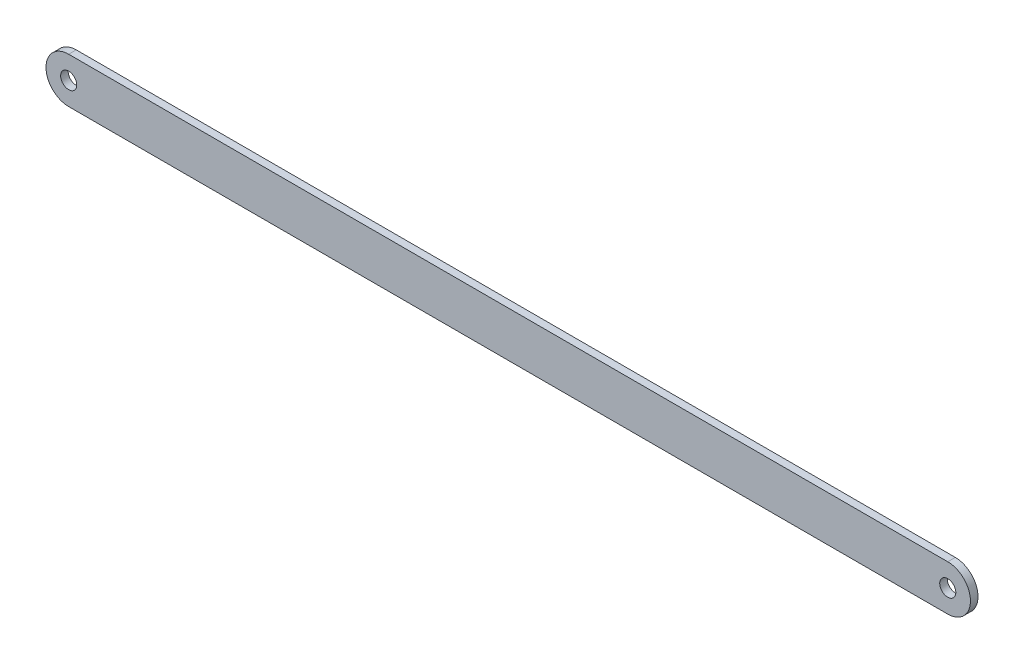
ISO-10303-21;
HEADER;
FILE_DESCRIPTION(('STEP AP214'),'2;1');
FILE_NAME('part.step','',(''),(''),'','','');
FILE_SCHEMA(('AUTOMOTIVE_DESIGN { 1 0 10303 214 1 1 1 1 }'));
ENDSEC;
DATA;
#1=APPLICATION_CONTEXT('core data for automotive mechanical design processes');
#2=APPLICATION_PROTOCOL_DEFINITION('international standard','automotive_design',2000,#1);
#3=PRODUCT_CONTEXT('',#1,'mechanical');
#4=PRODUCT('Part','Part','',(#3));
#5=PRODUCT_RELATED_PRODUCT_CATEGORY('part','',(#4));
#6=PRODUCT_DEFINITION_FORMATION('','',#4);
#7=PRODUCT_DEFINITION_CONTEXT('part definition',#1,'design');
#8=PRODUCT_DEFINITION('design','',#6,#7);
#9=PRODUCT_DEFINITION_SHAPE('','',#8);
#10=(LENGTH_UNIT() NAMED_UNIT(*) SI_UNIT(.MILLI.,.METRE.));
#11=(NAMED_UNIT(*) PLANE_ANGLE_UNIT() SI_UNIT($,.RADIAN.));
#12=(NAMED_UNIT(*) SI_UNIT($,.STERADIAN.) SOLID_ANGLE_UNIT());
#13=UNCERTAINTY_MEASURE_WITH_UNIT(LENGTH_MEASURE(1.E-05),#10,'distance_accuracy_value','');
#14=(GEOMETRIC_REPRESENTATION_CONTEXT(3) GLOBAL_UNCERTAINTY_ASSIGNED_CONTEXT((#13)) GLOBAL_UNIT_ASSIGNED_CONTEXT((#10,
#11,#12)) REPRESENTATION_CONTEXT('',''));
#15=CARTESIAN_POINT('',(0.,0.,0.));
#16=DIRECTION('',(0.,0.,1.));
#17=DIRECTION('',(1.,0.,0.));
#18=AXIS2_PLACEMENT_3D('',#15,#16,#17);
#19=CARTESIAN_POINT('',(184.587411542608,0.,1.5875));
#20=DIRECTION('',(0.,0.,-1.));
#21=DIRECTION('',(-1.,0.,0.));
#22=AXIS2_PLACEMENT_3D('',#19,#20,#21);
#23=CYLINDRICAL_SURFACE('',#22,9.52499999999999);
#24=CARTESIAN_POINT('',(184.587411542608,0.,-1.5875));
#25=DIRECTION('',(0.,0.,1.));
#26=DIRECTION('',(1.,0.,0.));
#27=AXIS2_PLACEMENT_3D('',#24,#25,#26);
#28=CIRCLE('',#27,9.52499999999999);
#29=CARTESIAN_POINT('',(184.587411542608,-9.52499999999999,-1.5875));
#30=VERTEX_POINT('',#29);
#31=CARTESIAN_POINT('',(184.587411542608,9.525,-1.5875));
#32=VERTEX_POINT('',#31);
#33=EDGE_CURVE('E98',#30,#32,#28,.T.);
#34=ORIENTED_EDGE('',*,*,#33,.T.);
#35=DIRECTION('',(0.,0.,-1.));
#36=VECTOR('',#35,1.);
#37=CARTESIAN_POINT('',(184.587411542608,9.525,1.5875));
#38=LINE('',#37,#36);
#39=CARTESIAN_POINT('',(184.587411542608,9.525,1.5875));
#40=VERTEX_POINT('',#39);
#41=EDGE_CURVE('E11',#40,#32,#38,.T.);
#42=ORIENTED_EDGE('',*,*,#41,.F.);
#43=CARTESIAN_POINT('',(184.587411542608,0.,1.5875));
#44=DIRECTION('',(0.,0.,1.));
#45=DIRECTION('',(1.,0.,0.));
#46=AXIS2_PLACEMENT_3D('',#43,#44,#45);
#47=CIRCLE('',#46,9.52499999999999);
#48=CARTESIAN_POINT('',(184.587411542608,-9.52499999999999,1.5875));
#49=VERTEX_POINT('',#48);
#50=EDGE_CURVE('E86',#49,#40,#47,.T.);
#51=ORIENTED_EDGE('',*,*,#50,.F.);
#52=DIRECTION('',(0.,0.,-1.));
#53=VECTOR('',#52,1.);
#54=CARTESIAN_POINT('',(184.587411542608,-9.52499999999999,1.5875));
#55=LINE('',#54,#53);
#56=EDGE_CURVE('E94',#49,#30,#55,.T.);
#57=ORIENTED_EDGE('',*,*,#56,.T.);
#58=EDGE_LOOP('',(#34,#42,#51,#57));
#59=FACE_BOUND('',#58,.T.);
#60=ADVANCED_FACE('F35',(#59),#23,.T.);
#61=CARTESIAN_POINT('',(184.587411542608,9.525,1.5875));
#62=DIRECTION('',(0.,-1.,0.));
#63=DIRECTION('',(1.,0.,0.));
#64=AXIS2_PLACEMENT_3D('',#61,#62,#63);
#65=PLANE('',#64);
#66=DIRECTION('',(-1.,0.,0.));
#67=VECTOR('',#66,1.);
#68=CARTESIAN_POINT('',(184.587411542608,9.525,-1.5875));
#69=LINE('',#68,#67);
#70=CARTESIAN_POINT('',(-184.587411542608,9.52499999999996,-1.5875));
#71=VERTEX_POINT('',#70);
#72=EDGE_CURVE('E90',#32,#71,#69,.T.);
#73=ORIENTED_EDGE('',*,*,#72,.T.);
#74=DIRECTION('',(0.,0.,-1.));
#75=VECTOR('',#74,1.);
#76=CARTESIAN_POINT('',(-184.587411542608,9.52499999999996,1.5875));
#77=LINE('',#76,#75);
#78=CARTESIAN_POINT('',(-184.587411542608,9.52499999999996,1.5875));
#79=VERTEX_POINT('',#78);
#80=EDGE_CURVE('E43',#79,#71,#77,.T.);
#81=ORIENTED_EDGE('',*,*,#80,.F.);
#82=DIRECTION('',(-1.,0.,0.));
#83=VECTOR('',#82,1.);
#84=CARTESIAN_POINT('',(184.587411542608,9.525,1.5875));
#85=LINE('',#84,#83);
#86=EDGE_CURVE('E81',#40,#79,#85,.T.);
#87=ORIENTED_EDGE('',*,*,#86,.F.);
#88=ORIENTED_EDGE('',*,*,#41,.T.);
#89=EDGE_LOOP('',(#73,#81,#87,#88));
#90=FACE_BOUND('',#89,.T.);
#91=ADVANCED_FACE('F89',(#90),#65,.F.);
#92=CARTESIAN_POINT('',(-184.587411542608,0.,1.5875));
#93=DIRECTION('',(0.,0.,-1.));
#94=DIRECTION('',(-1.,0.,0.));
#95=AXIS2_PLACEMENT_3D('',#92,#93,#94);
#96=CYLINDRICAL_SURFACE('',#95,9.52499999999999);
#97=CARTESIAN_POINT('',(-184.587411542608,0.,-1.5875));
#98=DIRECTION('',(0.,0.,1.));
#99=DIRECTION('',(1.,0.,0.));
#100=AXIS2_PLACEMENT_3D('',#97,#98,#99);
#101=CIRCLE('',#100,9.52499999999999);
#102=CARTESIAN_POINT('',(-184.587411542608,-9.52500000000003,-1.5875));
#103=VERTEX_POINT('',#102);
#104=EDGE_CURVE('E68',#71,#103,#101,.T.);
#105=ORIENTED_EDGE('',*,*,#104,.T.);
#106=DIRECTION('',(0.,0.,-1.));
#107=VECTOR('',#106,1.);
#108=CARTESIAN_POINT('',(-184.587411542608,-9.52500000000003,1.5875));
#109=LINE('',#108,#107);
#110=CARTESIAN_POINT('',(-184.587411542608,-9.52500000000003,1.5875));
#111=VERTEX_POINT('',#110);
#112=EDGE_CURVE('E91',#111,#103,#109,.T.);
#113=ORIENTED_EDGE('',*,*,#112,.F.);
#114=CARTESIAN_POINT('',(-184.587411542608,0.,1.5875));
#115=DIRECTION('',(0.,0.,1.));
#116=DIRECTION('',(1.,0.,0.));
#117=AXIS2_PLACEMENT_3D('',#114,#115,#116);
#118=CIRCLE('',#117,9.52499999999999);
#119=EDGE_CURVE('E84',#79,#111,#118,.T.);
#120=ORIENTED_EDGE('',*,*,#119,.F.);
#121=ORIENTED_EDGE('',*,*,#80,.T.);
#122=EDGE_LOOP('',(#105,#113,#120,#121));
#123=FACE_BOUND('',#122,.T.);
#124=ADVANCED_FACE('F92',(#123),#96,.T.);
#125=CARTESIAN_POINT('',(184.587411542608,-9.52499999999999,1.5875));
#126=DIRECTION('',(0.,1.,0.));
#127=DIRECTION('',(-1.,0.,0.));
#128=AXIS2_PLACEMENT_3D('',#125,#126,#127);
#129=PLANE('',#128);
#130=DIRECTION('',(1.,0.,0.));
#131=VECTOR('',#130,1.);
#132=CARTESIAN_POINT('',(184.587411542608,-9.52499999999999,-1.5875));
#133=LINE('',#132,#131);
#134=EDGE_CURVE('E74',#103,#30,#133,.T.);
#135=ORIENTED_EDGE('',*,*,#134,.T.);
#136=ORIENTED_EDGE('',*,*,#56,.F.);
#137=DIRECTION('',(1.,0.,0.));
#138=VECTOR('',#137,1.);
#139=CARTESIAN_POINT('',(184.587411542608,-9.52499999999999,1.5875));
#140=LINE('',#139,#138);
#141=EDGE_CURVE('E51',#111,#49,#140,.T.);
#142=ORIENTED_EDGE('',*,*,#141,.F.);
#143=ORIENTED_EDGE('',*,*,#112,.T.);
#144=EDGE_LOOP('',(#135,#136,#142,#143));
#145=FACE_BOUND('',#144,.T.);
#146=ADVANCED_FACE('F106',(#145),#129,.F.);
#147=CARTESIAN_POINT('',(184.587411542608,0.,1.5875));
#148=DIRECTION('',(0.,0.,1.));
#149=DIRECTION('',(1.,0.,0.));
#150=AXIS2_PLACEMENT_3D('',#147,#148,#149);
#151=PLANE('',#150);
#152=CARTESIAN_POINT('',(-184.587411542608,0.,1.5875));
#153=DIRECTION('',(0.,0.,1.));
#154=DIRECTION('',(1.,0.,0.));
#155=AXIS2_PLACEMENT_3D('',#152,#153,#154);
#156=CIRCLE('',#155,3.3782);
#157=CARTESIAN_POINT('',(-181.209211542608,0.,1.5875));
#158=VERTEX_POINT('',#157);
#159=EDGE_CURVE('E120',#158,#158,#156,.T.);
#160=ORIENTED_EDGE('',*,*,#159,.F.);
#161=EDGE_LOOP('',(#160));
#162=FACE_BOUND('',#161,.T.);
#163=CARTESIAN_POINT('',(184.587411542608,0.,1.5875));
#164=DIRECTION('',(0.,0.,1.));
#165=DIRECTION('',(1.,0.,0.));
#166=AXIS2_PLACEMENT_3D('',#163,#164,#165);
#167=CIRCLE('',#166,3.3782);
#168=CARTESIAN_POINT('',(187.965611542608,0.,1.5875));
#169=VERTEX_POINT('',#168);
#170=EDGE_CURVE('E114',#169,#169,#167,.T.);
#171=ORIENTED_EDGE('',*,*,#170,.F.);
#172=EDGE_LOOP('',(#171));
#173=FACE_BOUND('',#172,.T.);
#174=ORIENTED_EDGE('',*,*,#50,.T.);
#175=ORIENTED_EDGE('',*,*,#86,.T.);
#176=ORIENTED_EDGE('',*,*,#119,.T.);
#177=ORIENTED_EDGE('',*,*,#141,.T.);
#178=EDGE_LOOP('',(#174,#175,#176,#177));
#179=FACE_BOUND('',#178,.T.);
#180=ADVANCED_FACE('F82',(#162,#173,#179),#151,.T.);
#181=CARTESIAN_POINT('',(184.587411542608,0.,-1.5875));
#182=DIRECTION('',(0.,0.,1.));
#183=DIRECTION('',(1.,0.,0.));
#184=AXIS2_PLACEMENT_3D('',#181,#182,#183);
#185=PLANE('',#184);
#186=CARTESIAN_POINT('',(-184.587411542608,0.,-1.5875));
#187=DIRECTION('',(0.,0.,1.));
#188=DIRECTION('',(1.,0.,0.));
#189=AXIS2_PLACEMENT_3D('',#186,#187,#188);
#190=CIRCLE('',#189,3.3782);
#191=CARTESIAN_POINT('',(-181.209211542608,0.,-1.5875));
#192=VERTEX_POINT('',#191);
#193=EDGE_CURVE('E117',#192,#192,#190,.T.);
#194=ORIENTED_EDGE('',*,*,#193,.T.);
#195=EDGE_LOOP('',(#194));
#196=FACE_BOUND('',#195,.T.);
#197=CARTESIAN_POINT('',(184.587411542608,0.,-1.5875));
#198=DIRECTION('',(0.,0.,1.));
#199=DIRECTION('',(1.,0.,0.));
#200=AXIS2_PLACEMENT_3D('',#197,#198,#199);
#201=CIRCLE('',#200,3.3782);
#202=CARTESIAN_POINT('',(187.965611542608,0.,-1.5875));
#203=VERTEX_POINT('',#202);
#204=EDGE_CURVE('E101',#203,#203,#201,.T.);
#205=ORIENTED_EDGE('',*,*,#204,.T.);
#206=EDGE_LOOP('',(#205));
#207=FACE_BOUND('',#206,.T.);
#208=ORIENTED_EDGE('',*,*,#33,.F.);
#209=ORIENTED_EDGE('',*,*,#134,.F.);
#210=ORIENTED_EDGE('',*,*,#104,.F.);
#211=ORIENTED_EDGE('',*,*,#72,.F.);
#212=EDGE_LOOP('',(#208,#209,#210,#211));
#213=FACE_BOUND('',#212,.T.);
#214=ADVANCED_FACE('F109',(#196,#207,#213),#185,.F.);
#215=CARTESIAN_POINT('',(184.587411542608,0.,1.5875));
#216=DIRECTION('',(0.,0.,1.));
#217=DIRECTION('',(1.,0.,0.));
#218=AXIS2_PLACEMENT_3D('',#215,#216,#217);
#219=CYLINDRICAL_SURFACE('',#218,3.3782);
#220=ORIENTED_EDGE('',*,*,#204,.F.);
#221=EDGE_LOOP('',(#220));
#222=FACE_BOUND('',#221,.T.);
#223=ORIENTED_EDGE('',*,*,#170,.T.);
#224=EDGE_LOOP('',(#223));
#225=FACE_BOUND('',#224,.T.);
#226=ADVANCED_FACE('F131',(#222,#225),#219,.F.);
#227=CARTESIAN_POINT('',(-184.587411542608,0.,1.5875));
#228=DIRECTION('',(0.,0.,1.));
#229=DIRECTION('',(1.,0.,0.));
#230=AXIS2_PLACEMENT_3D('',#227,#228,#229);
#231=CYLINDRICAL_SURFACE('',#230,3.3782);
#232=ORIENTED_EDGE('',*,*,#193,.F.);
#233=EDGE_LOOP('',(#232));
#234=FACE_BOUND('',#233,.T.);
#235=ORIENTED_EDGE('',*,*,#159,.T.);
#236=EDGE_LOOP('',(#235));
#237=FACE_BOUND('',#236,.T.);
#238=ADVANCED_FACE('F124',(#234,#237),#231,.F.);
#239=CLOSED_SHELL('',(#60,#91,#124,#146,#180,#214,#226,#238));
#240=MANIFOLD_SOLID_BREP('B2',#239);
#241=ADVANCED_BREP_SHAPE_REPRESENTATION('',(#18,#240),#14);
#242=SHAPE_DEFINITION_REPRESENTATION(#9,#241);
ENDSEC;
END-ISO-10303-21;
